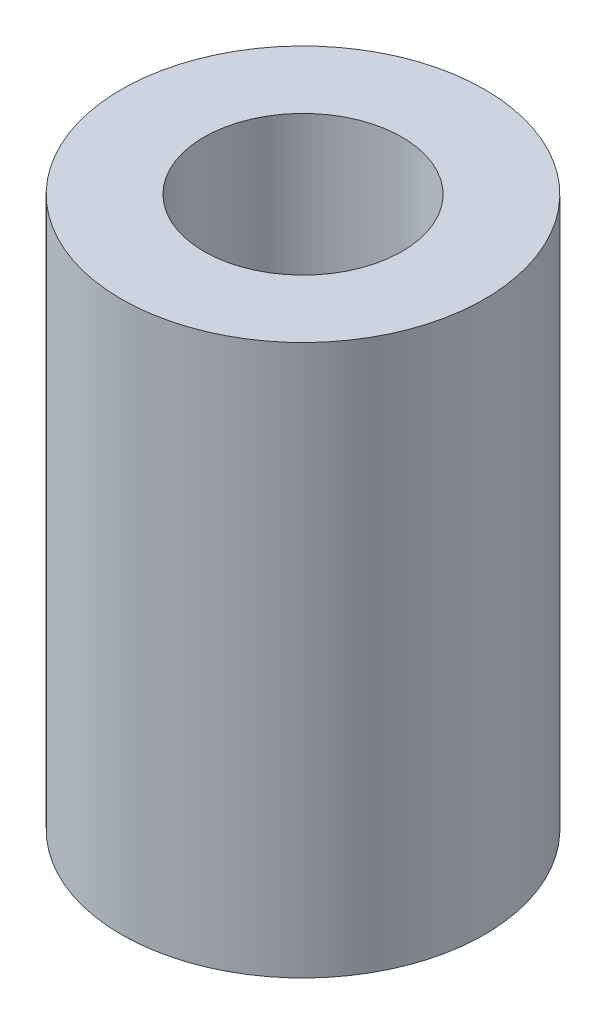
ISO-10303-21;
HEADER;
FILE_DESCRIPTION(('STEP AP214'),'2;1');
FILE_NAME('part.step','',(''),(''),'','','');
FILE_SCHEMA(('AUTOMOTIVE_DESIGN { 1 0 10303 214 1 1 1 1 }'));
ENDSEC;
DATA;
#1=APPLICATION_CONTEXT('core data for automotive mechanical design processes');
#2=APPLICATION_PROTOCOL_DEFINITION('international standard','automotive_design',2000,#1);
#3=PRODUCT_CONTEXT('',#1,'mechanical');
#4=PRODUCT('Part','Part','',(#3));
#5=PRODUCT_RELATED_PRODUCT_CATEGORY('part','',(#4));
#6=PRODUCT_DEFINITION_FORMATION('','',#4);
#7=PRODUCT_DEFINITION_CONTEXT('part definition',#1,'design');
#8=PRODUCT_DEFINITION('design','',#6,#7);
#9=PRODUCT_DEFINITION_SHAPE('','',#8);
#10=(LENGTH_UNIT() NAMED_UNIT(*) SI_UNIT(.MILLI.,.METRE.));
#11=(NAMED_UNIT(*) PLANE_ANGLE_UNIT() SI_UNIT($,.RADIAN.));
#12=(NAMED_UNIT(*) SI_UNIT($,.STERADIAN.) SOLID_ANGLE_UNIT());
#13=UNCERTAINTY_MEASURE_WITH_UNIT(LENGTH_MEASURE(1.E-05),#10,'distance_accuracy_value','');
#14=(GEOMETRIC_REPRESENTATION_CONTEXT(3) GLOBAL_UNCERTAINTY_ASSIGNED_CONTEXT((#13)) GLOBAL_UNIT_ASSIGNED_CONTEXT((#10,
#11,#12)) REPRESENTATION_CONTEXT('',''));
#15=CARTESIAN_POINT('',(0.,0.,0.));
#16=DIRECTION('',(0.,0.,1.));
#17=DIRECTION('',(1.,0.,0.));
#18=AXIS2_PLACEMENT_3D('',#15,#16,#17);
#19=CARTESIAN_POINT('',(0.,10.,0.));
#20=DIRECTION('',(0.,1.,0.));
#21=DIRECTION('',(0.,0.,1.));
#22=AXIS2_PLACEMENT_3D('',#19,#20,#21);
#23=PLANE('',#22);
#24=CARTESIAN_POINT('',(0.,10.,0.));
#25=DIRECTION('',(0.,1.,0.));
#26=DIRECTION('',(0.,0.,1.));
#27=AXIS2_PLACEMENT_3D('',#24,#25,#26);
#28=CIRCLE('',#27,3.3);
#29=CARTESIAN_POINT('',(0.,10.,3.3));
#30=VERTEX_POINT('',#29);
#31=EDGE_CURVE('E10',#30,#30,#28,.T.);
#32=ORIENTED_EDGE('',*,*,#31,.T.);
#33=EDGE_LOOP('',(#32));
#34=FACE_BOUND('',#33,.T.);
#35=CARTESIAN_POINT('',(0.,10.,0.));
#36=DIRECTION('',(0.,1.,0.));
#37=DIRECTION('',(0.,0.,1.));
#38=AXIS2_PLACEMENT_3D('',#35,#36,#37);
#39=CIRCLE('',#38,1.8);
#40=CARTESIAN_POINT('',(0.,10.,1.8));
#41=VERTEX_POINT('',#40);
#42=EDGE_CURVE('E42',#41,#41,#39,.T.);
#43=ORIENTED_EDGE('',*,*,#42,.F.);
#44=EDGE_LOOP('',(#43));
#45=FACE_BOUND('',#44,.T.);
#46=ADVANCED_FACE('F31',(#34,#45),#23,.T.);
#47=CARTESIAN_POINT('',(0.,0.,0.));
#48=DIRECTION('',(0.,1.,0.));
#49=DIRECTION('',(0.,0.,1.));
#50=AXIS2_PLACEMENT_3D('',#47,#48,#49);
#51=PLANE('',#50);
#52=CARTESIAN_POINT('',(0.,0.,0.));
#53=DIRECTION('',(0.,1.,0.));
#54=DIRECTION('',(0.,0.,1.));
#55=AXIS2_PLACEMENT_3D('',#52,#53,#54);
#56=CIRCLE('',#55,3.3);
#57=CARTESIAN_POINT('',(0.,0.,3.3));
#58=VERTEX_POINT('',#57);
#59=EDGE_CURVE('E35',#58,#58,#56,.T.);
#60=ORIENTED_EDGE('',*,*,#59,.F.);
#61=EDGE_LOOP('',(#60));
#62=FACE_BOUND('',#61,.T.);
#63=CARTESIAN_POINT('',(0.,0.,0.));
#64=DIRECTION('',(0.,1.,0.));
#65=DIRECTION('',(0.,0.,1.));
#66=AXIS2_PLACEMENT_3D('',#63,#64,#65);
#67=CIRCLE('',#66,1.8);
#68=CARTESIAN_POINT('',(0.,0.,1.8));
#69=VERTEX_POINT('',#68);
#70=EDGE_CURVE('E44',#69,#69,#67,.T.);
#71=ORIENTED_EDGE('',*,*,#70,.T.);
#72=EDGE_LOOP('',(#71));
#73=FACE_BOUND('',#72,.T.);
#74=ADVANCED_FACE('F54',(#62,#73),#51,.F.);
#75=CARTESIAN_POINT('',(0.,10.,0.));
#76=DIRECTION('',(0.,-1.,0.));
#77=DIRECTION('',(0.,0.,-1.));
#78=AXIS2_PLACEMENT_3D('',#75,#76,#77);
#79=CYLINDRICAL_SURFACE('',#78,3.3);
#80=ORIENTED_EDGE('',*,*,#31,.F.);
#81=EDGE_LOOP('',(#80));
#82=FACE_BOUND('',#81,.T.);
#83=ORIENTED_EDGE('',*,*,#59,.T.);
#84=EDGE_LOOP('',(#83));
#85=FACE_BOUND('',#84,.T.);
#86=ADVANCED_FACE('F33',(#82,#85),#79,.T.);
#87=CARTESIAN_POINT('',(0.,10.,0.));
#88=DIRECTION('',(0.,-1.,0.));
#89=DIRECTION('',(0.,0.,-1.));
#90=AXIS2_PLACEMENT_3D('',#87,#88,#89);
#91=CYLINDRICAL_SURFACE('',#90,1.8);
#92=ORIENTED_EDGE('',*,*,#42,.T.);
#93=EDGE_LOOP('',(#92));
#94=FACE_BOUND('',#93,.T.);
#95=ORIENTED_EDGE('',*,*,#70,.F.);
#96=EDGE_LOOP('',(#95));
#97=FACE_BOUND('',#96,.T.);
#98=ADVANCED_FACE('F50',(#94,#97),#91,.F.);
#99=CLOSED_SHELL('',(#46,#74,#86,#98));
#100=MANIFOLD_SOLID_BREP('B2',#99);
#101=ADVANCED_BREP_SHAPE_REPRESENTATION('',(#18,#100),#14);
#102=SHAPE_DEFINITION_REPRESENTATION(#9,#101);
ENDSEC;
END-ISO-10303-21;
